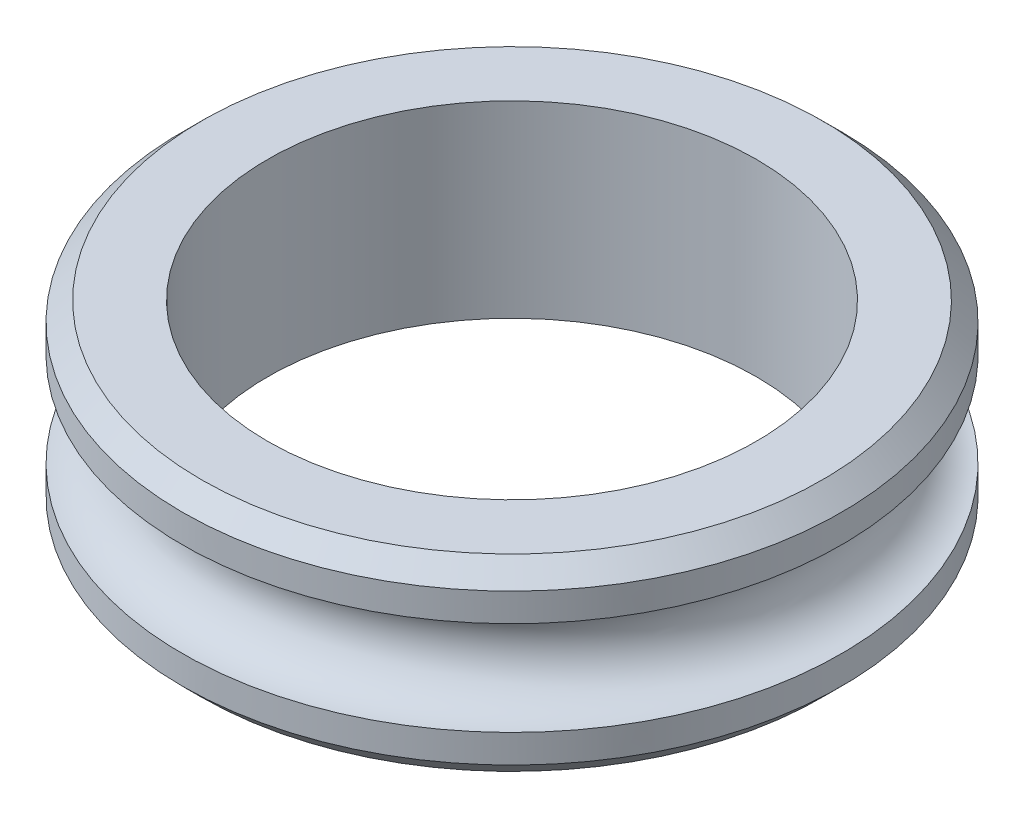
ISO-10303-21;
HEADER;
FILE_DESCRIPTION(('STEP AP214'),'2;1');
FILE_NAME('part.step','',(''),(''),'','','');
FILE_SCHEMA(('AUTOMOTIVE_DESIGN { 1 0 10303 214 1 1 1 1 }'));
ENDSEC;
DATA;
#1=APPLICATION_CONTEXT('core data for automotive mechanical design processes');
#2=APPLICATION_PROTOCOL_DEFINITION('international standard','automotive_design',2000,#1);
#3=PRODUCT_CONTEXT('',#1,'mechanical');
#4=PRODUCT('Part','Part','',(#3));
#5=PRODUCT_RELATED_PRODUCT_CATEGORY('part','',(#4));
#6=PRODUCT_DEFINITION_FORMATION('','',#4);
#7=PRODUCT_DEFINITION_CONTEXT('part definition',#1,'design');
#8=PRODUCT_DEFINITION('design','',#6,#7);
#9=PRODUCT_DEFINITION_SHAPE('','',#8);
#10=(LENGTH_UNIT() NAMED_UNIT(*) SI_UNIT(.MILLI.,.METRE.));
#11=(NAMED_UNIT(*) PLANE_ANGLE_UNIT() SI_UNIT($,.RADIAN.));
#12=(NAMED_UNIT(*) SI_UNIT($,.STERADIAN.) SOLID_ANGLE_UNIT());
#13=UNCERTAINTY_MEASURE_WITH_UNIT(LENGTH_MEASURE(1.E-05),#10,'distance_accuracy_value','');
#14=(GEOMETRIC_REPRESENTATION_CONTEXT(3) GLOBAL_UNCERTAINTY_ASSIGNED_CONTEXT((#13)) GLOBAL_UNIT_ASSIGNED_CONTEXT((#10,
#11,#12)) REPRESENTATION_CONTEXT('',''));
#15=CARTESIAN_POINT('',(0.,0.,0.));
#16=DIRECTION('',(0.,0.,1.));
#17=DIRECTION('',(1.,0.,0.));
#18=AXIS2_PLACEMENT_3D('',#15,#16,#17);
#19=CARTESIAN_POINT('',(0.,10.,0.));
#20=DIRECTION('',(0.,-1.,0.));
#21=DIRECTION('',(0.,0.,-1.));
#22=AXIS2_PLACEMENT_3D('',#19,#20,#21);
#23=CYLINDRICAL_SURFACE('',#22,17.5);
#24=CARTESIAN_POINT('',(0.,2.5,0.));
#25=DIRECTION('',(0.,-1.,0.));
#26=DIRECTION('',(0.,0.,-1.));
#27=AXIS2_PLACEMENT_3D('',#24,#25,#26);
#28=CIRCLE('',#27,17.5);
#29=CARTESIAN_POINT('',(0.,2.5,-17.5));
#30=VERTEX_POINT('',#29);
#31=EDGE_CURVE('E80',#30,#30,#28,.T.);
#32=ORIENTED_EDGE('',*,*,#31,.T.);
#33=EDGE_LOOP('',(#32));
#34=FACE_BOUND('',#33,.T.);
#35=CARTESIAN_POINT('',(0.,1.00000000000001,0.));
#36=DIRECTION('',(0.,1.,0.));
#37=DIRECTION('',(0.,0.,1.));
#38=AXIS2_PLACEMENT_3D('',#35,#36,#37);
#39=CIRCLE('',#38,17.5);
#40=CARTESIAN_POINT('',(0.,1.00000000000001,17.5));
#41=VERTEX_POINT('',#40);
#42=EDGE_CURVE('E57',#41,#41,#39,.T.);
#43=ORIENTED_EDGE('',*,*,#42,.T.);
#44=EDGE_LOOP('',(#43));
#45=FACE_BOUND('',#44,.T.);
#46=ADVANCED_FACE('F43',(#34,#45),#23,.T.);
#47=CARTESIAN_POINT('',(0.,10.,0.));
#48=DIRECTION('',(0.,-1.,0.));
#49=DIRECTION('',(0.,0.,-1.));
#50=AXIS2_PLACEMENT_3D('',#47,#48,#49);
#51=CYLINDRICAL_SURFACE('',#50,12.975);
#52=CARTESIAN_POINT('',(0.,10.,0.));
#53=DIRECTION('',(0.,1.,0.));
#54=DIRECTION('',(0.,0.,1.));
#55=AXIS2_PLACEMENT_3D('',#52,#53,#54);
#56=CIRCLE('',#55,12.975);
#57=CARTESIAN_POINT('',(0.,10.,12.975));
#58=VERTEX_POINT('',#57);
#59=EDGE_CURVE('E68',#58,#58,#56,.T.);
#60=ORIENTED_EDGE('',*,*,#59,.T.);
#61=EDGE_LOOP('',(#60));
#62=FACE_BOUND('',#61,.T.);
#63=CARTESIAN_POINT('',(0.,0.,0.));
#64=DIRECTION('',(0.,1.,0.));
#65=DIRECTION('',(0.,0.,1.));
#66=AXIS2_PLACEMENT_3D('',#63,#64,#65);
#67=CIRCLE('',#66,12.975);
#68=CARTESIAN_POINT('',(0.,0.,12.975));
#69=VERTEX_POINT('',#68);
#70=EDGE_CURVE('E69',#69,#69,#67,.T.);
#71=ORIENTED_EDGE('',*,*,#70,.F.);
#72=EDGE_LOOP('',(#71));
#73=FACE_BOUND('',#72,.T.);
#74=ADVANCED_FACE('F97',(#62,#73),#51,.F.);
#75=CARTESIAN_POINT('',(0.,7.5,0.));
#76=DIRECTION('',(0.,-1.,0.));
#77=DIRECTION('',(0.,0.,-1.));
#78=AXIS2_PLACEMENT_3D('',#75,#76,#77);
#79=CIRCLE('',#78,17.5);
#80=CARTESIAN_POINT('',(0.,7.5,-17.5));
#81=VERTEX_POINT('',#80);
#82=EDGE_CURVE('E73',#81,#81,#79,.T.);
#83=ORIENTED_EDGE('',*,*,#82,.F.);
#84=EDGE_LOOP('',(#83));
#85=FACE_BOUND('',#84,.T.);
#86=CARTESIAN_POINT('',(0.,9.,0.));
#87=DIRECTION('',(0.,1.,0.));
#88=DIRECTION('',(0.,0.,1.));
#89=AXIS2_PLACEMENT_3D('',#86,#87,#88);
#90=CIRCLE('',#89,17.5);
#91=CARTESIAN_POINT('',(0.,9.,17.5));
#92=VERTEX_POINT('',#91);
#93=EDGE_CURVE('E62',#92,#92,#90,.F.);
#94=ORIENTED_EDGE('',*,*,#93,.T.);
#95=EDGE_LOOP('',(#94));
#96=FACE_BOUND('',#95,.T.);
#97=ADVANCED_FACE('F93',(#85,#96),#23,.T.);
#98=CARTESIAN_POINT('',(0.,10.,0.));
#99=DIRECTION('',(0.,1.,0.));
#100=DIRECTION('',(0.,0.,1.));
#101=AXIS2_PLACEMENT_3D('',#98,#99,#100);
#102=PLANE('',#101);
#103=CARTESIAN_POINT('',(0.,10.,0.));
#104=DIRECTION('',(0.,1.,0.));
#105=DIRECTION('',(0.,0.,1.));
#106=AXIS2_PLACEMENT_3D('',#103,#104,#105);
#107=CIRCLE('',#106,16.5);
#108=CARTESIAN_POINT('',(0.,10.,16.5));
#109=VERTEX_POINT('',#108);
#110=EDGE_CURVE('E10',#109,#109,#107,.T.);
#111=ORIENTED_EDGE('',*,*,#110,.T.);
#112=EDGE_LOOP('',(#111));
#113=FACE_BOUND('',#112,.T.);
#114=ORIENTED_EDGE('',*,*,#59,.F.);
#115=EDGE_LOOP('',(#114));
#116=FACE_BOUND('',#115,.T.);
#117=ADVANCED_FACE('F96',(#113,#116),#102,.T.);
#118=CARTESIAN_POINT('',(0.,0.,0.));
#119=DIRECTION('',(0.,1.,0.));
#120=DIRECTION('',(0.,0.,1.));
#121=AXIS2_PLACEMENT_3D('',#118,#119,#120);
#122=PLANE('',#121);
#123=CARTESIAN_POINT('',(0.,0.,0.));
#124=DIRECTION('',(0.,1.,0.));
#125=DIRECTION('',(0.,0.,1.));
#126=AXIS2_PLACEMENT_3D('',#123,#124,#125);
#127=CIRCLE('',#126,16.5);
#128=CARTESIAN_POINT('',(0.,0.,16.5));
#129=VERTEX_POINT('',#128);
#130=EDGE_CURVE('E52',#129,#129,#127,.F.);
#131=ORIENTED_EDGE('',*,*,#130,.T.);
#132=EDGE_LOOP('',(#131));
#133=FACE_BOUND('',#132,.T.);
#134=ORIENTED_EDGE('',*,*,#70,.T.);
#135=EDGE_LOOP('',(#134));
#136=FACE_BOUND('',#135,.T.);
#137=ADVANCED_FACE('F107',(#133,#136),#122,.F.);
#138=CARTESIAN_POINT('',(0.,1.00000000000001,0.));
#139=DIRECTION('',(0.,1.,0.));
#140=DIRECTION('',(0.,0.,1.));
#141=AXIS2_PLACEMENT_3D('',#138,#139,#140);
#142=CONICAL_SURFACE('',#141,17.5,0.785398163397448);
#143=ORIENTED_EDGE('',*,*,#130,.F.);
#144=EDGE_LOOP('',(#143));
#145=FACE_BOUND('',#144,.T.);
#146=ORIENTED_EDGE('',*,*,#42,.F.);
#147=EDGE_LOOP('',(#146));
#148=FACE_BOUND('',#147,.T.);
#149=ADVANCED_FACE('F103',(#145,#148),#142,.T.);
#150=CARTESIAN_POINT('',(0.,10.,0.));
#151=DIRECTION('',(0.,-1.,0.));
#152=DIRECTION('',(0.,0.,-1.));
#153=AXIS2_PLACEMENT_3D('',#150,#151,#152);
#154=CONICAL_SURFACE('',#153,16.5,0.785398163397447);
#155=ORIENTED_EDGE('',*,*,#93,.F.);
#156=EDGE_LOOP('',(#155));
#157=FACE_BOUND('',#156,.T.);
#158=ORIENTED_EDGE('',*,*,#110,.F.);
#159=EDGE_LOOP('',(#158));
#160=FACE_BOUND('',#159,.T.);
#161=ADVANCED_FACE('F46',(#157,#160),#154,.T.);
#162=CARTESIAN_POINT('',(0.,5.00000000000001,0.));
#163=DIRECTION('',(0.,-1.,0.));
#164=DIRECTION('',(0.,0.,-1.));
#165=AXIS2_PLACEMENT_3D('',#162,#163,#164);
#166=TOROIDAL_SURFACE('',#165,17.5,2.5);
#167=ORIENTED_EDGE('',*,*,#31,.F.);
#168=EDGE_LOOP('',(#167));
#169=FACE_BOUND('',#168,.T.);
#170=ORIENTED_EDGE('',*,*,#82,.T.);
#171=EDGE_LOOP('',(#170));
#172=FACE_BOUND('',#171,.T.);
#173=ADVANCED_FACE('F87',(#169,#172),#166,.F.);
#174=CLOSED_SHELL('',(#46,#74,#97,#117,#137,#149,#161,#173));
#175=MANIFOLD_SOLID_BREP('B2',#174);
#176=ADVANCED_BREP_SHAPE_REPRESENTATION('',(#18,#175),#14);
#177=SHAPE_DEFINITION_REPRESENTATION(#9,#176);
ENDSEC;
END-ISO-10303-21;
